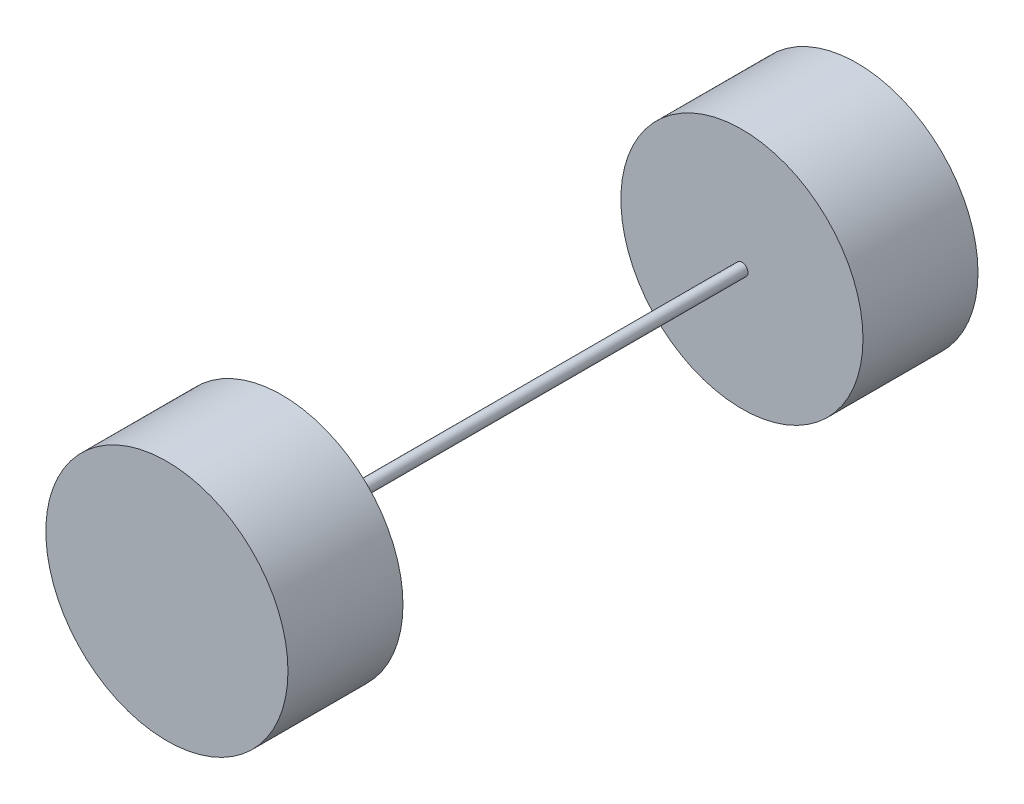
ISO-10303-21;
HEADER;
FILE_DESCRIPTION(('STEP AP214'),'2;1');
FILE_NAME('part.step','',(''),(''),'','','');
FILE_SCHEMA(('AUTOMOTIVE_DESIGN { 1 0 10303 214 1 1 1 1 }'));
ENDSEC;
DATA;
#1=APPLICATION_CONTEXT('core data for automotive mechanical design processes');
#2=APPLICATION_PROTOCOL_DEFINITION('international standard','automotive_design',2000,#1);
#3=PRODUCT_CONTEXT('',#1,'mechanical');
#4=PRODUCT('Part','Part','',(#3));
#5=PRODUCT_RELATED_PRODUCT_CATEGORY('part','',(#4));
#6=PRODUCT_DEFINITION_FORMATION('','',#4);
#7=PRODUCT_DEFINITION_CONTEXT('part definition',#1,'design');
#8=PRODUCT_DEFINITION('design','',#6,#7);
#9=PRODUCT_DEFINITION_SHAPE('','',#8);
#10=(LENGTH_UNIT() NAMED_UNIT(*) SI_UNIT(.MILLI.,.METRE.));
#11=(NAMED_UNIT(*) PLANE_ANGLE_UNIT() SI_UNIT($,.RADIAN.));
#12=(NAMED_UNIT(*) SI_UNIT($,.STERADIAN.) SOLID_ANGLE_UNIT());
#13=UNCERTAINTY_MEASURE_WITH_UNIT(LENGTH_MEASURE(1.E-05),#10,'distance_accuracy_value','');
#14=(GEOMETRIC_REPRESENTATION_CONTEXT(3) GLOBAL_UNCERTAINTY_ASSIGNED_CONTEXT((#13)) GLOBAL_UNIT_ASSIGNED_CONTEXT((#10,
#11,#12)) REPRESENTATION_CONTEXT('',''));
#15=CARTESIAN_POINT('',(0.,0.,0.));
#16=DIRECTION('',(0.,0.,1.));
#17=DIRECTION('',(1.,0.,0.));
#18=AXIS2_PLACEMENT_3D('',#15,#16,#17);
#19=CARTESIAN_POINT('',(0.,0.,19.));
#20=DIRECTION('',(0.,0.,-1.));
#21=DIRECTION('',(-1.,0.,0.));
#22=AXIS2_PLACEMENT_3D('',#19,#20,#21);
#23=CYLINDRICAL_SURFACE('',#22,20.);
#24=CARTESIAN_POINT('',(0.,0.,19.));
#25=DIRECTION('',(0.,0.,1.));
#26=DIRECTION('',(1.,0.,0.));
#27=AXIS2_PLACEMENT_3D('',#24,#25,#26);
#28=CIRCLE('',#27,20.);
#29=CARTESIAN_POINT('',(20.,0.,19.));
#30=VERTEX_POINT('',#29);
#31=EDGE_CURVE('E10',#30,#30,#28,.T.);
#32=ORIENTED_EDGE('',*,*,#31,.F.);
#33=EDGE_LOOP('',(#32));
#34=FACE_BOUND('',#33,.T.);
#35=CARTESIAN_POINT('',(0.,0.,0.));
#36=DIRECTION('',(0.,0.,1.));
#37=DIRECTION('',(1.,0.,0.));
#38=AXIS2_PLACEMENT_3D('',#35,#36,#37);
#39=CIRCLE('',#38,20.);
#40=CARTESIAN_POINT('',(20.,0.,0.));
#41=VERTEX_POINT('',#40);
#42=EDGE_CURVE('E44',#41,#41,#39,.T.);
#43=ORIENTED_EDGE('',*,*,#42,.T.);
#44=EDGE_LOOP('',(#43));
#45=FACE_BOUND('',#44,.T.);
#46=ADVANCED_FACE('F41',(#34,#45),#23,.T.);
#47=CARTESIAN_POINT('',(0.,0.,19.));
#48=DIRECTION('',(0.,0.,1.));
#49=DIRECTION('',(1.,0.,0.));
#50=AXIS2_PLACEMENT_3D('',#47,#48,#49);
#51=PLANE('',#50);
#52=CARTESIAN_POINT('',(0.,0.,19.));
#53=DIRECTION('',(0.,0.,1.));
#54=DIRECTION('',(1.,0.,0.));
#55=AXIS2_PLACEMENT_3D('',#52,#53,#54);
#56=CIRCLE('',#55,1.);
#57=CARTESIAN_POINT('',(1.,0.,19.));
#58=VERTEX_POINT('',#57);
#59=EDGE_CURVE('E55',#58,#58,#56,.T.);
#60=ORIENTED_EDGE('',*,*,#59,.F.);
#61=EDGE_LOOP('',(#60));
#62=FACE_BOUND('',#61,.T.);
#63=ORIENTED_EDGE('',*,*,#31,.T.);
#64=EDGE_LOOP('',(#63));
#65=FACE_BOUND('',#64,.T.);
#66=ADVANCED_FACE('F89',(#62,#65),#51,.T.);
#67=CARTESIAN_POINT('',(0.,0.,0.));
#68=DIRECTION('',(0.,0.,1.));
#69=DIRECTION('',(1.,0.,0.));
#70=AXIS2_PLACEMENT_3D('',#67,#68,#69);
#71=PLANE('',#70);
#72=ORIENTED_EDGE('',*,*,#42,.F.);
#73=EDGE_LOOP('',(#72));
#74=FACE_BOUND('',#73,.T.);
#75=ADVANCED_FACE('F94',(#74),#71,.F.);
#76=CARTESIAN_POINT('',(0.,0.,95.));
#77=DIRECTION('',(0.,0.,-1.));
#78=DIRECTION('',(-1.,0.,0.));
#79=AXIS2_PLACEMENT_3D('',#76,#77,#78);
#80=CYLINDRICAL_SURFACE('',#79,1.);
#81=CARTESIAN_POINT('',(0.,0.,95.));
#82=DIRECTION('',(0.,0.,1.));
#83=DIRECTION('',(1.,0.,0.));
#84=AXIS2_PLACEMENT_3D('',#81,#82,#83);
#85=CIRCLE('',#84,1.);
#86=CARTESIAN_POINT('',(1.,0.,95.));
#87=VERTEX_POINT('',#86);
#88=EDGE_CURVE('E53',#87,#87,#85,.T.);
#89=ORIENTED_EDGE('',*,*,#88,.F.);
#90=EDGE_LOOP('',(#89));
#91=FACE_BOUND('',#90,.T.);
#92=ORIENTED_EDGE('',*,*,#59,.T.);
#93=EDGE_LOOP('',(#92));
#94=FACE_BOUND('',#93,.T.);
#95=ADVANCED_FACE('F76',(#91,#94),#80,.T.);
#96=CARTESIAN_POINT('',(0.,0.,114.));
#97=DIRECTION('',(0.,0.,-1.));
#98=DIRECTION('',(-1.,0.,0.));
#99=AXIS2_PLACEMENT_3D('',#96,#97,#98);
#100=CYLINDRICAL_SURFACE('',#99,20.);
#101=CARTESIAN_POINT('',(0.,0.,114.));
#102=DIRECTION('',(0.,0.,1.));
#103=DIRECTION('',(1.,0.,0.));
#104=AXIS2_PLACEMENT_3D('',#101,#102,#103);
#105=CIRCLE('',#104,20.);
#106=CARTESIAN_POINT('',(20.,0.,114.));
#107=VERTEX_POINT('',#106);
#108=EDGE_CURVE('E59',#107,#107,#105,.T.);
#109=ORIENTED_EDGE('',*,*,#108,.F.);
#110=EDGE_LOOP('',(#109));
#111=FACE_BOUND('',#110,.T.);
#112=CARTESIAN_POINT('',(0.,0.,95.));
#113=DIRECTION('',(0.,0.,1.));
#114=DIRECTION('',(1.,0.,0.));
#115=AXIS2_PLACEMENT_3D('',#112,#113,#114);
#116=CIRCLE('',#115,20.);
#117=CARTESIAN_POINT('',(20.,0.,95.));
#118=VERTEX_POINT('',#117);
#119=EDGE_CURVE('E63',#118,#118,#116,.T.);
#120=ORIENTED_EDGE('',*,*,#119,.T.);
#121=EDGE_LOOP('',(#120));
#122=FACE_BOUND('',#121,.T.);
#123=ADVANCED_FACE('F73',(#111,#122),#100,.T.);
#124=CARTESIAN_POINT('',(0.,0.,114.));
#125=DIRECTION('',(0.,0.,1.));
#126=DIRECTION('',(1.,0.,0.));
#127=AXIS2_PLACEMENT_3D('',#124,#125,#126);
#128=PLANE('',#127);
#129=ORIENTED_EDGE('',*,*,#108,.T.);
#130=EDGE_LOOP('',(#129));
#131=FACE_BOUND('',#130,.T.);
#132=ADVANCED_FACE('F71',(#131),#128,.T.);
#133=CARTESIAN_POINT('',(0.,0.,95.));
#134=DIRECTION('',(0.,0.,1.));
#135=DIRECTION('',(1.,0.,0.));
#136=AXIS2_PLACEMENT_3D('',#133,#134,#135);
#137=PLANE('',#136);
#138=ORIENTED_EDGE('',*,*,#88,.T.);
#139=EDGE_LOOP('',(#138));
#140=FACE_BOUND('',#139,.T.);
#141=ORIENTED_EDGE('',*,*,#119,.F.);
#142=EDGE_LOOP('',(#141));
#143=FACE_BOUND('',#142,.T.);
#144=ADVANCED_FACE('F80',(#140,#143),#137,.F.);
#145=CLOSED_SHELL('',(#46,#66,#75,#95,#123,#132,#144));
#146=MANIFOLD_SOLID_BREP('B2',#145);
#147=ADVANCED_BREP_SHAPE_REPRESENTATION('',(#18,#146),#14);
#148=SHAPE_DEFINITION_REPRESENTATION(#9,#147);
ENDSEC;
END-ISO-10303-21;
